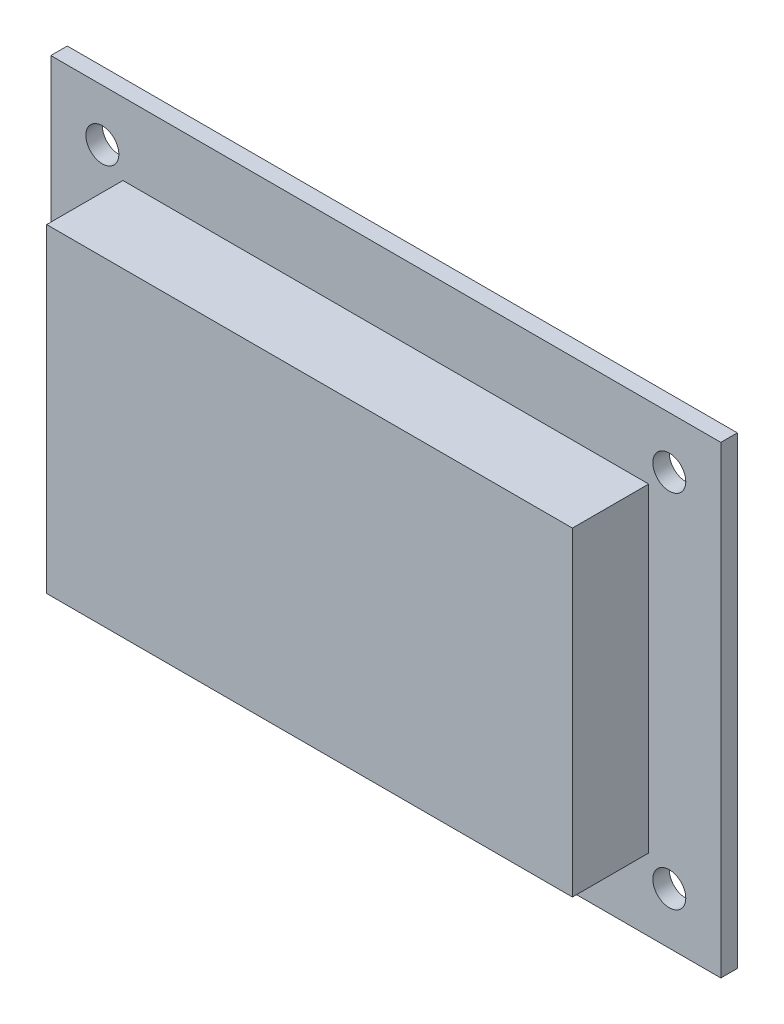
ISO-10303-21;
HEADER;
FILE_DESCRIPTION(('STEP AP214'),'2;1');
FILE_NAME('part.step','',(''),(''),'','','');
FILE_SCHEMA(('AUTOMOTIVE_DESIGN { 1 0 10303 214 1 1 1 1 }'));
ENDSEC;
DATA;
#1=APPLICATION_CONTEXT('core data for automotive mechanical design processes');
#2=APPLICATION_PROTOCOL_DEFINITION('international standard','automotive_design',2000,#1);
#3=PRODUCT_CONTEXT('',#1,'mechanical');
#4=PRODUCT('Part','Part','',(#3));
#5=PRODUCT_RELATED_PRODUCT_CATEGORY('part','',(#4));
#6=PRODUCT_DEFINITION_FORMATION('','',#4);
#7=PRODUCT_DEFINITION_CONTEXT('part definition',#1,'design');
#8=PRODUCT_DEFINITION('design','',#6,#7);
#9=PRODUCT_DEFINITION_SHAPE('','',#8);
#10=(LENGTH_UNIT() NAMED_UNIT(*) SI_UNIT(.MILLI.,.METRE.));
#11=(NAMED_UNIT(*) PLANE_ANGLE_UNIT() SI_UNIT($,.RADIAN.));
#12=(NAMED_UNIT(*) SI_UNIT($,.STERADIAN.) SOLID_ANGLE_UNIT());
#13=UNCERTAINTY_MEASURE_WITH_UNIT(LENGTH_MEASURE(1.E-05),#10,'distance_accuracy_value','');
#14=(GEOMETRIC_REPRESENTATION_CONTEXT(3) GLOBAL_UNCERTAINTY_ASSIGNED_CONTEXT((#13)) GLOBAL_UNIT_ASSIGNED_CONTEXT((#10,
#11,#12)) REPRESENTATION_CONTEXT('',''));
#15=CARTESIAN_POINT('',(0.,0.,0.));
#16=DIRECTION('',(0.,0.,1.));
#17=DIRECTION('',(1.,0.,0.));
#18=AXIS2_PLACEMENT_3D('',#15,#16,#17);
#19=CARTESIAN_POINT('',(-25.5,-15.5,9.));
#20=DIRECTION('',(0.,0.,1.));
#21=DIRECTION('',(1.,0.,0.));
#22=AXIS2_PLACEMENT_3D('',#19,#20,#21);
#23=PLANE('',#22);
#24=DIRECTION('',(0.,1.,0.));
#25=VECTOR('',#24,1.);
#26=CARTESIAN_POINT('',(-25.5,-15.5,9.));
#27=LINE('',#26,#25);
#28=CARTESIAN_POINT('',(-25.5,-15.5,9.));
#29=VERTEX_POINT('',#28);
#30=CARTESIAN_POINT('',(-25.5,15.5,9.));
#31=VERTEX_POINT('',#30);
#32=EDGE_CURVE('E134',#29,#31,#27,.T.);
#33=ORIENTED_EDGE('',*,*,#32,.F.);
#34=DIRECTION('',(1.,0.,0.));
#35=VECTOR('',#34,1.);
#36=CARTESIAN_POINT('',(-25.5,-15.5,9.));
#37=LINE('',#36,#35);
#38=CARTESIAN_POINT('',(25.5,-15.5,9.));
#39=VERTEX_POINT('',#38);
#40=EDGE_CURVE('E161',#29,#39,#37,.T.);
#41=ORIENTED_EDGE('',*,*,#40,.T.);
#42=DIRECTION('',(0.,1.,0.));
#43=VECTOR('',#42,1.);
#44=CARTESIAN_POINT('',(25.5,-15.5,9.));
#45=LINE('',#44,#43);
#46=CARTESIAN_POINT('',(25.5,15.5,9.));
#47=VERTEX_POINT('',#46);
#48=EDGE_CURVE('E160',#39,#47,#45,.T.);
#49=ORIENTED_EDGE('',*,*,#48,.T.);
#50=DIRECTION('',(1.,0.,0.));
#51=VECTOR('',#50,1.);
#52=CARTESIAN_POINT('',(-25.5,15.5,9.));
#53=LINE('',#52,#51);
#54=EDGE_CURVE('E38',#31,#47,#53,.T.);
#55=ORIENTED_EDGE('',*,*,#54,.F.);
#56=EDGE_LOOP('',(#33,#41,#49,#55));
#57=FACE_BOUND('',#56,.T.);
#58=ADVANCED_FACE('F14',(#57),#23,.T.);
#59=CARTESIAN_POINT('',(27.5,17.5,-2.5));
#60=DIRECTION('',(0.,0.,1.));
#61=DIRECTION('',(1.,0.,0.));
#62=AXIS2_PLACEMENT_3D('',#59,#60,#61);
#63=CYLINDRICAL_SURFACE('',#62,1.6);
#64=DIRECTION('',(0.,0.,1.));
#65=VECTOR('',#64,1.);
#66=CARTESIAN_POINT('',(29.1,17.5,-2.5));
#67=LINE('',#66,#65);
#68=CARTESIAN_POINT('',(29.1,17.5,0.));
#69=VERTEX_POINT('',#68);
#70=CARTESIAN_POINT('',(29.1,17.5,1.6));
#71=VERTEX_POINT('',#70);
#72=EDGE_CURVE('E9',#69,#71,#67,.T.);
#73=ORIENTED_EDGE('',*,*,#72,.F.);
#74=CARTESIAN_POINT('',(27.5,17.5,0.));
#75=DIRECTION('',(0.,0.,1.));
#76=DIRECTION('',(1.,0.,0.));
#77=AXIS2_PLACEMENT_3D('',#74,#75,#76);
#78=CIRCLE('',#77,1.6);
#79=EDGE_CURVE('E18',#69,#69,#78,.T.);
#80=ORIENTED_EDGE('',*,*,#79,.F.);
#81=ORIENTED_EDGE('',*,*,#72,.T.);
#82=CARTESIAN_POINT('',(27.5,17.5,1.6));
#83=DIRECTION('',(0.,0.,1.));
#84=DIRECTION('',(1.,0.,0.));
#85=AXIS2_PLACEMENT_3D('',#82,#83,#84);
#86=CIRCLE('',#85,1.6);
#87=EDGE_CURVE('E206',#71,#71,#86,.T.);
#88=ORIENTED_EDGE('',*,*,#87,.T.);
#89=EDGE_LOOP('',(#73,#80,#81,#88));
#90=FACE_BOUND('',#89,.T.);
#91=ADVANCED_FACE('F301',(#90),#63,.F.);
#92=CARTESIAN_POINT('',(-27.5,17.5,-2.5));
#93=DIRECTION('',(0.,0.,1.));
#94=DIRECTION('',(1.,0.,0.));
#95=AXIS2_PLACEMENT_3D('',#92,#93,#94);
#96=CYLINDRICAL_SURFACE('',#95,1.6);
#97=DIRECTION('',(0.,0.,1.));
#98=VECTOR('',#97,1.);
#99=CARTESIAN_POINT('',(-25.9,17.5,-2.5));
#100=LINE('',#99,#98);
#101=CARTESIAN_POINT('',(-25.9,17.5,0.));
#102=VERTEX_POINT('',#101);
#103=CARTESIAN_POINT('',(-25.9,17.5,1.6));
#104=VERTEX_POINT('',#103);
#105=EDGE_CURVE('E25',#102,#104,#100,.T.);
#106=ORIENTED_EDGE('',*,*,#105,.F.);
#107=CARTESIAN_POINT('',(-27.5,17.5,0.));
#108=DIRECTION('',(0.,0.,1.));
#109=DIRECTION('',(1.,0.,0.));
#110=AXIS2_PLACEMENT_3D('',#107,#108,#109);
#111=CIRCLE('',#110,1.6);
#112=EDGE_CURVE('E145',#102,#102,#111,.T.);
#113=ORIENTED_EDGE('',*,*,#112,.F.);
#114=ORIENTED_EDGE('',*,*,#105,.T.);
#115=CARTESIAN_POINT('',(-27.5,17.5,1.6));
#116=DIRECTION('',(0.,0.,1.));
#117=DIRECTION('',(1.,0.,0.));
#118=AXIS2_PLACEMENT_3D('',#115,#116,#117);
#119=CIRCLE('',#118,1.6);
#120=EDGE_CURVE('E202',#104,#104,#119,.T.);
#121=ORIENTED_EDGE('',*,*,#120,.T.);
#122=EDGE_LOOP('',(#106,#113,#114,#121));
#123=FACE_BOUND('',#122,.T.);
#124=ADVANCED_FACE('F307',(#123),#96,.F.);
#125=CARTESIAN_POINT('',(27.5,-17.5,-2.5));
#126=DIRECTION('',(0.,0.,1.));
#127=DIRECTION('',(1.,0.,0.));
#128=AXIS2_PLACEMENT_3D('',#125,#126,#127);
#129=CYLINDRICAL_SURFACE('',#128,1.6);
#130=DIRECTION('',(0.,0.,1.));
#131=VECTOR('',#130,1.);
#132=CARTESIAN_POINT('',(29.1,-17.5,-2.5));
#133=LINE('',#132,#131);
#134=CARTESIAN_POINT('',(29.1,-17.5,0.));
#135=VERTEX_POINT('',#134);
#136=CARTESIAN_POINT('',(29.1,-17.5,1.6));
#137=VERTEX_POINT('',#136);
#138=EDGE_CURVE('E188',#135,#137,#133,.T.);
#139=ORIENTED_EDGE('',*,*,#138,.F.);
#140=CARTESIAN_POINT('',(27.5,-17.5,0.));
#141=DIRECTION('',(0.,0.,1.));
#142=DIRECTION('',(1.,0.,0.));
#143=AXIS2_PLACEMENT_3D('',#140,#141,#142);
#144=CIRCLE('',#143,1.6);
#145=EDGE_CURVE('E170',#135,#135,#144,.T.);
#146=ORIENTED_EDGE('',*,*,#145,.F.);
#147=ORIENTED_EDGE('',*,*,#138,.T.);
#148=CARTESIAN_POINT('',(27.5,-17.5,1.6));
#149=DIRECTION('',(0.,0.,1.));
#150=DIRECTION('',(1.,0.,0.));
#151=AXIS2_PLACEMENT_3D('',#148,#149,#150);
#152=CIRCLE('',#151,1.6);
#153=EDGE_CURVE('E207',#137,#137,#152,.T.);
#154=ORIENTED_EDGE('',*,*,#153,.T.);
#155=EDGE_LOOP('',(#139,#146,#147,#154));
#156=FACE_BOUND('',#155,.T.);
#157=ADVANCED_FACE('F312',(#156),#129,.F.);
#158=CARTESIAN_POINT('',(-25.5,15.5,1.6));
#159=DIRECTION('',(0.,1.,0.));
#160=DIRECTION('',(1.,0.,0.));
#161=AXIS2_PLACEMENT_3D('',#158,#159,#160);
#162=PLANE('',#161);
#163=DIRECTION('',(1.,0.,0.));
#164=VECTOR('',#163,1.);
#165=CARTESIAN_POINT('',(-25.5,15.5,1.6));
#166=LINE('',#165,#164);
#167=CARTESIAN_POINT('',(-25.5,15.5,1.6));
#168=VERTEX_POINT('',#167);
#169=CARTESIAN_POINT('',(25.5,15.5,1.6));
#170=VERTEX_POINT('',#169);
#171=EDGE_CURVE('E211',#168,#170,#166,.T.);
#172=ORIENTED_EDGE('',*,*,#171,.F.);
#173=DIRECTION('',(0.,0.,1.));
#174=VECTOR('',#173,1.);
#175=CARTESIAN_POINT('',(-25.5,15.5,1.6));
#176=LINE('',#175,#174);
#177=EDGE_CURVE('E142',#168,#31,#176,.T.);
#178=ORIENTED_EDGE('',*,*,#177,.T.);
#179=ORIENTED_EDGE('',*,*,#54,.T.);
#180=DIRECTION('',(0.,0.,1.));
#181=VECTOR('',#180,1.);
#182=CARTESIAN_POINT('',(25.5,15.5,1.6));
#183=LINE('',#182,#181);
#184=EDGE_CURVE('E156',#170,#47,#183,.T.);
#185=ORIENTED_EDGE('',*,*,#184,.F.);
#186=EDGE_LOOP('',(#172,#178,#179,#185));
#187=FACE_BOUND('',#186,.T.);
#188=ADVANCED_FACE('F16',(#187),#162,.T.);
#189=CARTESIAN_POINT('',(25.5,-15.5,1.6));
#190=DIRECTION('',(1.,0.,0.));
#191=DIRECTION('',(0.,1.,0.));
#192=AXIS2_PLACEMENT_3D('',#189,#190,#191);
#193=PLANE('',#192);
#194=DIRECTION('',(0.,0.,1.));
#195=VECTOR('',#194,1.);
#196=CARTESIAN_POINT('',(25.5,-15.5,1.6));
#197=LINE('',#196,#195);
#198=CARTESIAN_POINT('',(25.5,-15.5,1.6));
#199=VERTEX_POINT('',#198);
#200=EDGE_CURVE('E165',#199,#39,#197,.T.);
#201=ORIENTED_EDGE('',*,*,#200,.F.);
#202=DIRECTION('',(0.,1.,0.));
#203=VECTOR('',#202,1.);
#204=CARTESIAN_POINT('',(25.5,-15.5,1.6));
#205=LINE('',#204,#203);
#206=EDGE_CURVE('E148',#199,#170,#205,.T.);
#207=ORIENTED_EDGE('',*,*,#206,.T.);
#208=ORIENTED_EDGE('',*,*,#184,.T.);
#209=ORIENTED_EDGE('',*,*,#48,.F.);
#210=EDGE_LOOP('',(#201,#207,#208,#209));
#211=FACE_BOUND('',#210,.T.);
#212=ADVANCED_FACE('F314',(#211),#193,.T.);
#213=CARTESIAN_POINT('',(-25.5,-15.5,1.6));
#214=DIRECTION('',(0.,1.,0.));
#215=DIRECTION('',(1.,0.,0.));
#216=AXIS2_PLACEMENT_3D('',#213,#214,#215);
#217=PLANE('',#216);
#218=ORIENTED_EDGE('',*,*,#200,.T.);
#219=ORIENTED_EDGE('',*,*,#40,.F.);
#220=DIRECTION('',(0.,0.,1.));
#221=VECTOR('',#220,1.);
#222=CARTESIAN_POINT('',(-25.5,-15.5,1.6));
#223=LINE('',#222,#221);
#224=CARTESIAN_POINT('',(-25.5,-15.5,1.6));
#225=VERTEX_POINT('',#224);
#226=EDGE_CURVE('E182',#225,#29,#223,.T.);
#227=ORIENTED_EDGE('',*,*,#226,.F.);
#228=DIRECTION('',(1.,0.,0.));
#229=VECTOR('',#228,1.);
#230=CARTESIAN_POINT('',(-25.5,-15.5,1.6));
#231=LINE('',#230,#229);
#232=EDGE_CURVE('E221',#225,#199,#231,.T.);
#233=ORIENTED_EDGE('',*,*,#232,.T.);
#234=EDGE_LOOP('',(#218,#219,#227,#233));
#235=FACE_BOUND('',#234,.T.);
#236=ADVANCED_FACE('F316',(#235),#217,.F.);
#237=CARTESIAN_POINT('',(-25.5,-15.5,1.6));
#238=DIRECTION('',(1.,0.,0.));
#239=DIRECTION('',(0.,1.,0.));
#240=AXIS2_PLACEMENT_3D('',#237,#238,#239);
#241=PLANE('',#240);
#242=ORIENTED_EDGE('',*,*,#32,.T.);
#243=ORIENTED_EDGE('',*,*,#177,.F.);
#244=DIRECTION('',(0.,1.,0.));
#245=VECTOR('',#244,1.);
#246=CARTESIAN_POINT('',(-25.5,-15.5,1.6));
#247=LINE('',#246,#245);
#248=EDGE_CURVE('E180',#225,#168,#247,.T.);
#249=ORIENTED_EDGE('',*,*,#248,.F.);
#250=ORIENTED_EDGE('',*,*,#226,.T.);
#251=EDGE_LOOP('',(#242,#243,#249,#250));
#252=FACE_BOUND('',#251,.T.);
#253=ADVANCED_FACE('F321',(#252),#241,.F.);
#254=CARTESIAN_POINT('',(-27.5,-17.5,-2.5));
#255=DIRECTION('',(0.,0.,1.));
#256=DIRECTION('',(1.,0.,0.));
#257=AXIS2_PLACEMENT_3D('',#254,#255,#256);
#258=CYLINDRICAL_SURFACE('',#257,1.6);
#259=DIRECTION('',(0.,0.,1.));
#260=VECTOR('',#259,1.);
#261=CARTESIAN_POINT('',(-25.9,-17.5,-2.5));
#262=LINE('',#261,#260);
#263=CARTESIAN_POINT('',(-25.9,-17.5,0.));
#264=VERTEX_POINT('',#263);
#265=CARTESIAN_POINT('',(-25.9,-17.5,1.6));
#266=VERTEX_POINT('',#265);
#267=EDGE_CURVE('E127',#264,#266,#262,.T.);
#268=ORIENTED_EDGE('',*,*,#267,.F.);
#269=CARTESIAN_POINT('',(-27.5,-17.5,0.));
#270=DIRECTION('',(0.,0.,1.));
#271=DIRECTION('',(1.,0.,0.));
#272=AXIS2_PLACEMENT_3D('',#269,#270,#271);
#273=CIRCLE('',#272,1.6);
#274=EDGE_CURVE('E132',#264,#264,#273,.T.);
#275=ORIENTED_EDGE('',*,*,#274,.F.);
#276=ORIENTED_EDGE('',*,*,#267,.T.);
#277=CARTESIAN_POINT('',(-27.5,-17.5,1.6));
#278=DIRECTION('',(0.,0.,1.));
#279=DIRECTION('',(1.,0.,0.));
#280=AXIS2_PLACEMENT_3D('',#277,#278,#279);
#281=CIRCLE('',#280,1.6);
#282=EDGE_CURVE('E130',#266,#266,#281,.T.);
#283=ORIENTED_EDGE('',*,*,#282,.T.);
#284=EDGE_LOOP('',(#268,#275,#276,#283));
#285=FACE_BOUND('',#284,.T.);
#286=ADVANCED_FACE('F128',(#285),#258,.F.);
#287=CARTESIAN_POINT('',(32.5,-22.5,0.));
#288=DIRECTION('',(1.,0.,0.));
#289=DIRECTION('',(0.,1.,0.));
#290=AXIS2_PLACEMENT_3D('',#287,#288,#289);
#291=PLANE('',#290);
#292=DIRECTION('',(0.,0.,1.));
#293=VECTOR('',#292,1.);
#294=CARTESIAN_POINT('',(32.5,-22.5,0.));
#295=LINE('',#294,#293);
#296=CARTESIAN_POINT('',(32.5,-22.5,0.));
#297=VERTEX_POINT('',#296);
#298=CARTESIAN_POINT('',(32.5,-22.5,1.6));
#299=VERTEX_POINT('',#298);
#300=EDGE_CURVE('E169',#297,#299,#295,.T.);
#301=ORIENTED_EDGE('',*,*,#300,.F.);
#302=DIRECTION('',(0.,1.,0.));
#303=VECTOR('',#302,1.);
#304=CARTESIAN_POINT('',(32.5,-22.5,0.));
#305=LINE('',#304,#303);
#306=CARTESIAN_POINT('',(32.5,22.5,0.));
#307=VERTEX_POINT('',#306);
#308=EDGE_CURVE('E195',#297,#307,#305,.T.);
#309=ORIENTED_EDGE('',*,*,#308,.T.);
#310=DIRECTION('',(0.,0.,1.));
#311=VECTOR('',#310,1.);
#312=CARTESIAN_POINT('',(32.5,22.5,0.));
#313=LINE('',#312,#311);
#314=CARTESIAN_POINT('',(32.5,22.5,1.6));
#315=VERTEX_POINT('',#314);
#316=EDGE_CURVE('E226',#307,#315,#313,.T.);
#317=ORIENTED_EDGE('',*,*,#316,.T.);
#318=DIRECTION('',(0.,1.,0.));
#319=VECTOR('',#318,1.);
#320=CARTESIAN_POINT('',(32.5,-22.5,1.6));
#321=LINE('',#320,#319);
#322=EDGE_CURVE('E154',#299,#315,#321,.T.);
#323=ORIENTED_EDGE('',*,*,#322,.F.);
#324=EDGE_LOOP('',(#301,#309,#317,#323));
#325=FACE_BOUND('',#324,.T.);
#326=ADVANCED_FACE('F284',(#325),#291,.T.);
#327=CARTESIAN_POINT('',(-32.5,-22.5,0.));
#328=DIRECTION('',(0.,0.,1.));
#329=DIRECTION('',(1.,0.,0.));
#330=AXIS2_PLACEMENT_3D('',#327,#328,#329);
#331=PLANE('',#330);
#332=ORIENTED_EDGE('',*,*,#79,.T.);
#333=EDGE_LOOP('',(#332));
#334=FACE_BOUND('',#333,.T.);
#335=ORIENTED_EDGE('',*,*,#112,.T.);
#336=EDGE_LOOP('',(#335));
#337=FACE_BOUND('',#336,.T.);
#338=ORIENTED_EDGE('',*,*,#145,.T.);
#339=EDGE_LOOP('',(#338));
#340=FACE_BOUND('',#339,.T.);
#341=ORIENTED_EDGE('',*,*,#274,.T.);
#342=EDGE_LOOP('',(#341));
#343=FACE_BOUND('',#342,.T.);
#344=DIRECTION('',(1.,0.,0.));
#345=VECTOR('',#344,1.);
#346=CARTESIAN_POINT('',(-32.5,22.5,0.));
#347=LINE('',#346,#345);
#348=CARTESIAN_POINT('',(-32.5,22.5,0.));
#349=VERTEX_POINT('',#348);
#350=EDGE_CURVE('E234',#349,#307,#347,.T.);
#351=ORIENTED_EDGE('',*,*,#350,.T.);
#352=ORIENTED_EDGE('',*,*,#308,.F.);
#353=DIRECTION('',(1.,0.,0.));
#354=VECTOR('',#353,1.);
#355=CARTESIAN_POINT('',(-32.5,-22.5,0.));
#356=LINE('',#355,#354);
#357=CARTESIAN_POINT('',(-32.5,-22.5,0.));
#358=VERTEX_POINT('',#357);
#359=EDGE_CURVE('E150',#358,#297,#356,.T.);
#360=ORIENTED_EDGE('',*,*,#359,.F.);
#361=DIRECTION('',(0.,1.,0.));
#362=VECTOR('',#361,1.);
#363=CARTESIAN_POINT('',(-32.5,-22.5,0.));
#364=LINE('',#363,#362);
#365=EDGE_CURVE('E189',#358,#349,#364,.T.);
#366=ORIENTED_EDGE('',*,*,#365,.T.);
#367=EDGE_LOOP('',(#351,#352,#360,#366));
#368=FACE_BOUND('',#367,.T.);
#369=ADVANCED_FACE('F286',(#334,#337,#340,#343,#368),#331,.F.);
#370=CARTESIAN_POINT('',(-32.5,22.5,0.));
#371=DIRECTION('',(0.,1.,0.));
#372=DIRECTION('',(1.,0.,0.));
#373=AXIS2_PLACEMENT_3D('',#370,#371,#372);
#374=PLANE('',#373);
#375=ORIENTED_EDGE('',*,*,#350,.F.);
#376=DIRECTION('',(0.,0.,1.));
#377=VECTOR('',#376,1.);
#378=CARTESIAN_POINT('',(-32.5,22.5,0.));
#379=LINE('',#378,#377);
#380=CARTESIAN_POINT('',(-32.5,22.5,1.6));
#381=VERTEX_POINT('',#380);
#382=EDGE_CURVE('E193',#349,#381,#379,.T.);
#383=ORIENTED_EDGE('',*,*,#382,.T.);
#384=DIRECTION('',(1.,0.,0.));
#385=VECTOR('',#384,1.);
#386=CARTESIAN_POINT('',(-32.5,22.5,1.6));
#387=LINE('',#386,#385);
#388=EDGE_CURVE('E181',#381,#315,#387,.T.);
#389=ORIENTED_EDGE('',*,*,#388,.T.);
#390=ORIENTED_EDGE('',*,*,#316,.F.);
#391=EDGE_LOOP('',(#375,#383,#389,#390));
#392=FACE_BOUND('',#391,.T.);
#393=ADVANCED_FACE('F273',(#392),#374,.T.);
#394=CARTESIAN_POINT('',(-32.5,-22.5,1.6));
#395=DIRECTION('',(0.,0.,1.));
#396=DIRECTION('',(1.,0.,0.));
#397=AXIS2_PLACEMENT_3D('',#394,#395,#396);
#398=PLANE('',#397);
#399=ORIENTED_EDGE('',*,*,#87,.F.);
#400=EDGE_LOOP('',(#399));
#401=FACE_BOUND('',#400,.T.);
#402=ORIENTED_EDGE('',*,*,#120,.F.);
#403=EDGE_LOOP('',(#402));
#404=FACE_BOUND('',#403,.T.);
#405=ORIENTED_EDGE('',*,*,#153,.F.);
#406=EDGE_LOOP('',(#405));
#407=FACE_BOUND('',#406,.T.);
#408=ORIENTED_EDGE('',*,*,#248,.T.);
#409=ORIENTED_EDGE('',*,*,#171,.T.);
#410=ORIENTED_EDGE('',*,*,#206,.F.);
#411=ORIENTED_EDGE('',*,*,#232,.F.);
#412=EDGE_LOOP('',(#408,#409,#410,#411));
#413=FACE_BOUND('',#412,.T.);
#414=ORIENTED_EDGE('',*,*,#282,.F.);
#415=EDGE_LOOP('',(#414));
#416=FACE_BOUND('',#415,.T.);
#417=DIRECTION('',(0.,1.,0.));
#418=VECTOR('',#417,1.);
#419=CARTESIAN_POINT('',(-32.5,-22.5,1.6));
#420=LINE('',#419,#418);
#421=CARTESIAN_POINT('',(-32.5,-22.5,1.6));
#422=VERTEX_POINT('',#421);
#423=EDGE_CURVE('E264',#422,#381,#420,.T.);
#424=ORIENTED_EDGE('',*,*,#423,.F.);
#425=DIRECTION('',(1.,0.,0.));
#426=VECTOR('',#425,1.);
#427=CARTESIAN_POINT('',(-32.5,-22.5,1.6));
#428=LINE('',#427,#426);
#429=EDGE_CURVE('E155',#422,#299,#428,.T.);
#430=ORIENTED_EDGE('',*,*,#429,.T.);
#431=ORIENTED_EDGE('',*,*,#322,.T.);
#432=ORIENTED_EDGE('',*,*,#388,.F.);
#433=EDGE_LOOP('',(#424,#430,#431,#432));
#434=FACE_BOUND('',#433,.T.);
#435=ADVANCED_FACE('F281',(#401,#404,#407,#413,#416,#434),#398,.T.);
#436=CARTESIAN_POINT('',(-32.5,-22.5,0.));
#437=DIRECTION('',(0.,1.,0.));
#438=DIRECTION('',(1.,0.,0.));
#439=AXIS2_PLACEMENT_3D('',#436,#437,#438);
#440=PLANE('',#439);
#441=ORIENTED_EDGE('',*,*,#300,.T.);
#442=ORIENTED_EDGE('',*,*,#429,.F.);
#443=DIRECTION('',(0.,0.,1.));
#444=VECTOR('',#443,1.);
#445=CARTESIAN_POINT('',(-32.5,-22.5,0.));
#446=LINE('',#445,#444);
#447=EDGE_CURVE('E177',#358,#422,#446,.T.);
#448=ORIENTED_EDGE('',*,*,#447,.F.);
#449=ORIENTED_EDGE('',*,*,#359,.T.);
#450=EDGE_LOOP('',(#441,#442,#448,#449));
#451=FACE_BOUND('',#450,.T.);
#452=ADVANCED_FACE('F288',(#451),#440,.F.);
#453=CARTESIAN_POINT('',(-32.5,-22.5,0.));
#454=DIRECTION('',(1.,0.,0.));
#455=DIRECTION('',(0.,1.,0.));
#456=AXIS2_PLACEMENT_3D('',#453,#454,#455);
#457=PLANE('',#456);
#458=ORIENTED_EDGE('',*,*,#423,.T.);
#459=ORIENTED_EDGE('',*,*,#382,.F.);
#460=ORIENTED_EDGE('',*,*,#365,.F.);
#461=ORIENTED_EDGE('',*,*,#447,.T.);
#462=EDGE_LOOP('',(#458,#459,#460,#461));
#463=FACE_BOUND('',#462,.T.);
#464=ADVANCED_FACE('F278',(#463),#457,.F.);
#465=CLOSED_SHELL('',(#58,#91,#124,#157,#188,#212,#236,#253,#286,#326,#369,#393,#435,#452,#464));
#466=MANIFOLD_SOLID_BREP('B1',#465);
#467=ADVANCED_BREP_SHAPE_REPRESENTATION('',(#18,#466),#14);
#468=SHAPE_DEFINITION_REPRESENTATION(#9,#467);
ENDSEC;
END-ISO-10303-21;
